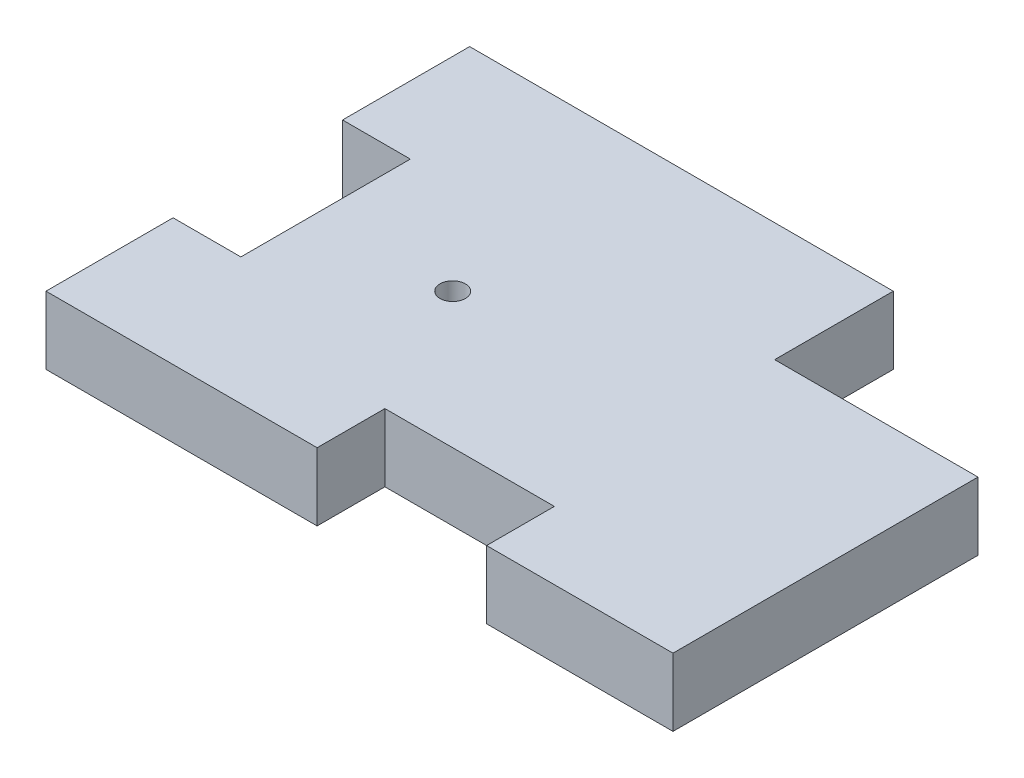
ISO-10303-21;
HEADER;
FILE_DESCRIPTION(('STEP AP214'),'2;1');
FILE_NAME('part.step','',(''),(''),'','','');
FILE_SCHEMA(('AUTOMOTIVE_DESIGN { 1 0 10303 214 1 1 1 1 }'));
ENDSEC;
DATA;
#1=APPLICATION_CONTEXT('core data for automotive mechanical design processes');
#2=APPLICATION_PROTOCOL_DEFINITION('international standard','automotive_design',2000,#1);
#3=PRODUCT_CONTEXT('',#1,'mechanical');
#4=PRODUCT('Part','Part','',(#3));
#5=PRODUCT_RELATED_PRODUCT_CATEGORY('part','',(#4));
#6=PRODUCT_DEFINITION_FORMATION('','',#4);
#7=PRODUCT_DEFINITION_CONTEXT('part definition',#1,'design');
#8=PRODUCT_DEFINITION('design','',#6,#7);
#9=PRODUCT_DEFINITION_SHAPE('','',#8);
#10=(LENGTH_UNIT() NAMED_UNIT(*) SI_UNIT(.MILLI.,.METRE.));
#11=(NAMED_UNIT(*) PLANE_ANGLE_UNIT() SI_UNIT($,.RADIAN.));
#12=(NAMED_UNIT(*) SI_UNIT($,.STERADIAN.) SOLID_ANGLE_UNIT());
#13=UNCERTAINTY_MEASURE_WITH_UNIT(LENGTH_MEASURE(1.E-05),#10,'distance_accuracy_value','');
#14=(GEOMETRIC_REPRESENTATION_CONTEXT(3) GLOBAL_UNCERTAINTY_ASSIGNED_CONTEXT((#13)) GLOBAL_UNIT_ASSIGNED_CONTEXT((#10,
#11,#12)) REPRESENTATION_CONTEXT('',''));
#15=CARTESIAN_POINT('',(0.,0.,0.));
#16=DIRECTION('',(0.,0.,1.));
#17=DIRECTION('',(1.,0.,0.));
#18=AXIS2_PLACEMENT_3D('',#15,#16,#17);
#19=CARTESIAN_POINT('',(0.,4.,25.));
#20=DIRECTION('',(0.,0.,-1.));
#21=DIRECTION('',(-1.,0.,0.));
#22=AXIS2_PLACEMENT_3D('',#19,#20,#21);
#23=PLANE('',#22);
#24=DIRECTION('',(1.,0.,0.));
#25=VECTOR('',#24,1.);
#26=CARTESIAN_POINT('',(0.,0.,25.));
#27=LINE('',#26,#25);
#28=CARTESIAN_POINT('',(0.,0.,25.));
#29=VERTEX_POINT('',#28);
#30=CARTESIAN_POINT('',(15.9999999999999,0.,25.));
#31=VERTEX_POINT('',#30);
#32=EDGE_CURVE('E231',#29,#31,#27,.T.);
#33=ORIENTED_EDGE('',*,*,#32,.T.);
#34=DIRECTION('',(0.,-1.,0.));
#35=VECTOR('',#34,1.);
#36=CARTESIAN_POINT('',(15.9999999999999,4.,25.));
#37=LINE('',#36,#35);
#38=CARTESIAN_POINT('',(15.9999999999999,4.,25.));
#39=VERTEX_POINT('',#38);
#40=EDGE_CURVE('E166',#39,#31,#37,.T.);
#41=ORIENTED_EDGE('',*,*,#40,.F.);
#42=DIRECTION('',(1.,0.,0.));
#43=VECTOR('',#42,1.);
#44=CARTESIAN_POINT('',(0.,4.,25.));
#45=LINE('',#44,#43);
#46=CARTESIAN_POINT('',(0.,4.,25.));
#47=VERTEX_POINT('',#46);
#48=EDGE_CURVE('E153',#47,#39,#45,.T.);
#49=ORIENTED_EDGE('',*,*,#48,.F.);
#50=DIRECTION('',(0.,-1.,0.));
#51=VECTOR('',#50,1.);
#52=CARTESIAN_POINT('',(0.,4.,25.));
#53=LINE('',#52,#51);
#54=EDGE_CURVE('E11',#47,#29,#53,.T.);
#55=ORIENTED_EDGE('',*,*,#54,.T.);
#56=EDGE_LOOP('',(#33,#41,#49,#55));
#57=FACE_BOUND('',#56,.T.);
#58=ADVANCED_FACE('F33',(#57),#23,.F.);
#59=CARTESIAN_POINT('',(0.,4.,0.));
#60=DIRECTION('',(1.,0.,0.));
#61=DIRECTION('',(0.,0.,-1.));
#62=AXIS2_PLACEMENT_3D('',#59,#60,#61);
#63=PLANE('',#62);
#64=DIRECTION('',(0.,0.,1.));
#65=VECTOR('',#64,1.);
#66=CARTESIAN_POINT('',(0.,0.,0.));
#67=LINE('',#66,#65);
#68=CARTESIAN_POINT('',(0.,0.,0.));
#69=VERTEX_POINT('',#68);
#70=CARTESIAN_POINT('',(0.,0.,7.5));
#71=VERTEX_POINT('',#70);
#72=EDGE_CURVE('E227',#69,#71,#67,.T.);
#73=ORIENTED_EDGE('',*,*,#72,.T.);
#74=DIRECTION('',(0.,-1.,0.));
#75=VECTOR('',#74,1.);
#76=CARTESIAN_POINT('',(0.,4.,7.5));
#77=LINE('',#76,#75);
#78=CARTESIAN_POINT('',(0.,4.,7.5));
#79=VERTEX_POINT('',#78);
#80=EDGE_CURVE('E191',#79,#71,#77,.T.);
#81=ORIENTED_EDGE('',*,*,#80,.F.);
#82=DIRECTION('',(0.,0.,1.));
#83=VECTOR('',#82,1.);
#84=CARTESIAN_POINT('',(0.,4.,0.));
#85=LINE('',#84,#83);
#86=CARTESIAN_POINT('',(0.,4.,0.));
#87=VERTEX_POINT('',#86);
#88=EDGE_CURVE('E215',#87,#79,#85,.T.);
#89=ORIENTED_EDGE('',*,*,#88,.F.);
#90=DIRECTION('',(0.,-1.,0.));
#91=VECTOR('',#90,1.);
#92=CARTESIAN_POINT('',(0.,4.,0.));
#93=LINE('',#92,#91);
#94=EDGE_CURVE('E226',#87,#69,#93,.T.);
#95=ORIENTED_EDGE('',*,*,#94,.T.);
#96=EDGE_LOOP('',(#73,#81,#89,#95));
#97=FACE_BOUND('',#96,.T.);
#98=ADVANCED_FACE('F283',(#97),#63,.F.);
#99=CARTESIAN_POINT('',(0.,4.,17.5));
#100=VERTEX_POINT('',#99);
#101=EDGE_CURVE('E219',#100,#47,#85,.T.);
#102=ORIENTED_EDGE('',*,*,#101,.F.);
#103=DIRECTION('',(0.,-1.,0.));
#104=VECTOR('',#103,1.);
#105=CARTESIAN_POINT('',(0.,4.,17.5));
#106=LINE('',#105,#104);
#107=CARTESIAN_POINT('',(0.,0.,17.5));
#108=VERTEX_POINT('',#107);
#109=EDGE_CURVE('E193',#100,#108,#106,.T.);
#110=ORIENTED_EDGE('',*,*,#109,.T.);
#111=EDGE_CURVE('E211',#108,#29,#67,.T.);
#112=ORIENTED_EDGE('',*,*,#111,.T.);
#113=ORIENTED_EDGE('',*,*,#54,.F.);
#114=EDGE_LOOP('',(#102,#110,#112,#113));
#115=FACE_BOUND('',#114,.T.);
#116=ADVANCED_FACE('F35',(#115),#63,.F.);
#117=CARTESIAN_POINT('',(25.9999999999999,4.,25.));
#118=VERTEX_POINT('',#117);
#119=CARTESIAN_POINT('',(37.,4.,25.));
#120=VERTEX_POINT('',#119);
#121=EDGE_CURVE('E218',#118,#120,#45,.T.);
#122=ORIENTED_EDGE('',*,*,#121,.F.);
#123=DIRECTION('',(0.,-1.,0.));
#124=VECTOR('',#123,1.);
#125=CARTESIAN_POINT('',(25.9999999999999,4.,25.));
#126=LINE('',#125,#124);
#127=CARTESIAN_POINT('',(25.9999999999999,0.,25.));
#128=VERTEX_POINT('',#127);
#129=EDGE_CURVE('E168',#118,#128,#126,.T.);
#130=ORIENTED_EDGE('',*,*,#129,.T.);
#131=CARTESIAN_POINT('',(37.,0.,25.));
#132=VERTEX_POINT('',#131);
#133=EDGE_CURVE('E230',#128,#132,#27,.T.);
#134=ORIENTED_EDGE('',*,*,#133,.T.);
#135=DIRECTION('',(0.,-1.,0.));
#136=VECTOR('',#135,1.);
#137=CARTESIAN_POINT('',(37.,4.,25.));
#138=LINE('',#137,#136);
#139=EDGE_CURVE('E41',#120,#132,#138,.T.);
#140=ORIENTED_EDGE('',*,*,#139,.F.);
#141=EDGE_LOOP('',(#122,#130,#134,#140));
#142=FACE_BOUND('',#141,.T.);
#143=ADVANCED_FACE('F262',(#142),#23,.F.);
#144=CARTESIAN_POINT('',(37.,4.,0.));
#145=DIRECTION('',(-1.,0.,0.));
#146=DIRECTION('',(0.,0.,1.));
#147=AXIS2_PLACEMENT_3D('',#144,#145,#146);
#148=PLANE('',#147);
#149=DIRECTION('',(0.,0.,-1.));
#150=VECTOR('',#149,1.);
#151=CARTESIAN_POINT('',(37.,0.,0.));
#152=LINE('',#151,#150);
#153=CARTESIAN_POINT('',(37.,0.,7.));
#154=VERTEX_POINT('',#153);
#155=EDGE_CURVE('E234',#132,#154,#152,.T.);
#156=ORIENTED_EDGE('',*,*,#155,.T.);
#157=DIRECTION('',(0.,1.,0.));
#158=VECTOR('',#157,1.);
#159=CARTESIAN_POINT('',(37.,0.,7.));
#160=LINE('',#159,#158);
#161=CARTESIAN_POINT('',(37.,4.,7.));
#162=VERTEX_POINT('',#161);
#163=EDGE_CURVE('E208',#154,#162,#160,.T.);
#164=ORIENTED_EDGE('',*,*,#163,.T.);
#165=DIRECTION('',(0.,0.,-1.));
#166=VECTOR('',#165,1.);
#167=CARTESIAN_POINT('',(37.,4.,0.));
#168=LINE('',#167,#166);
#169=EDGE_CURVE('E221',#120,#162,#168,.T.);
#170=ORIENTED_EDGE('',*,*,#169,.F.);
#171=ORIENTED_EDGE('',*,*,#139,.T.);
#172=EDGE_LOOP('',(#156,#164,#170,#171));
#173=FACE_BOUND('',#172,.T.);
#174=ADVANCED_FACE('F245',(#173),#148,.F.);
#175=CARTESIAN_POINT('',(0.,4.,0.));
#176=DIRECTION('',(0.,0.,1.));
#177=DIRECTION('',(1.,0.,0.));
#178=AXIS2_PLACEMENT_3D('',#175,#176,#177);
#179=PLANE('',#178);
#180=DIRECTION('',(-1.,0.,0.));
#181=VECTOR('',#180,1.);
#182=CARTESIAN_POINT('',(0.,4.,0.));
#183=LINE('',#182,#181);
#184=CARTESIAN_POINT('',(25.,4.,0.));
#185=VERTEX_POINT('',#184);
#186=EDGE_CURVE('E224',#185,#87,#183,.T.);
#187=ORIENTED_EDGE('',*,*,#186,.F.);
#188=DIRECTION('',(0.,1.,0.));
#189=VECTOR('',#188,1.);
#190=CARTESIAN_POINT('',(25.,0.,0.));
#191=LINE('',#190,#189);
#192=CARTESIAN_POINT('',(25.,0.,0.));
#193=VERTEX_POINT('',#192);
#194=EDGE_CURVE('E204',#193,#185,#191,.T.);
#195=ORIENTED_EDGE('',*,*,#194,.F.);
#196=DIRECTION('',(-1.,0.,0.));
#197=VECTOR('',#196,1.);
#198=CARTESIAN_POINT('',(0.,0.,0.));
#199=LINE('',#198,#197);
#200=EDGE_CURVE('E237',#193,#69,#199,.T.);
#201=ORIENTED_EDGE('',*,*,#200,.T.);
#202=ORIENTED_EDGE('',*,*,#94,.F.);
#203=EDGE_LOOP('',(#187,#195,#201,#202));
#204=FACE_BOUND('',#203,.T.);
#205=ADVANCED_FACE('F287',(#204),#179,.F.);
#206=CARTESIAN_POINT('',(0.,4.,0.));
#207=DIRECTION('',(0.,1.,0.));
#208=DIRECTION('',(0.,0.,1.));
#209=AXIS2_PLACEMENT_3D('',#206,#207,#208);
#210=PLANE('',#209);
#211=CARTESIAN_POINT('',(12.,4.,13.));
#212=DIRECTION('',(0.,1.,0.));
#213=DIRECTION('',(0.,0.,1.));
#214=AXIS2_PLACEMENT_3D('',#211,#212,#213);
#215=CIRCLE('',#214,0.75);
#216=CARTESIAN_POINT('',(12.,4.,13.75));
#217=VERTEX_POINT('',#216);
#218=EDGE_CURVE('E159',#217,#217,#215,.T.);
#219=ORIENTED_EDGE('',*,*,#218,.F.);
#220=EDGE_LOOP('',(#219));
#221=FACE_BOUND('',#220,.T.);
#222=DIRECTION('',(0.,0.,-1.));
#223=VECTOR('',#222,1.);
#224=CARTESIAN_POINT('',(15.9999999999999,4.,21.));
#225=LINE('',#224,#223);
#226=CARTESIAN_POINT('',(15.9999999999999,4.,21.));
#227=VERTEX_POINT('',#226);
#228=EDGE_CURVE('E135',#39,#227,#225,.T.);
#229=ORIENTED_EDGE('',*,*,#228,.T.);
#230=DIRECTION('',(1.,0.,0.));
#231=VECTOR('',#230,1.);
#232=CARTESIAN_POINT('',(15.9999999999999,4.,21.));
#233=LINE('',#232,#231);
#234=CARTESIAN_POINT('',(25.9999999999999,4.,21.));
#235=VERTEX_POINT('',#234);
#236=EDGE_CURVE('E144',#227,#235,#233,.T.);
#237=ORIENTED_EDGE('',*,*,#236,.T.);
#238=DIRECTION('',(0.,0.,1.));
#239=VECTOR('',#238,1.);
#240=CARTESIAN_POINT('',(25.9999999999999,4.,21.));
#241=LINE('',#240,#239);
#242=EDGE_CURVE('E141',#235,#118,#241,.T.);
#243=ORIENTED_EDGE('',*,*,#242,.T.);
#244=ORIENTED_EDGE('',*,*,#121,.T.);
#245=ORIENTED_EDGE('',*,*,#169,.T.);
#246=DIRECTION('',(1.,0.,0.));
#247=VECTOR('',#246,1.);
#248=CARTESIAN_POINT('',(37.,4.,7.));
#249=LINE('',#248,#247);
#250=CARTESIAN_POINT('',(25.,4.,7.));
#251=VERTEX_POINT('',#250);
#252=EDGE_CURVE('E201',#251,#162,#249,.T.);
#253=ORIENTED_EDGE('',*,*,#252,.F.);
#254=DIRECTION('',(0.,0.,1.));
#255=VECTOR('',#254,1.);
#256=CARTESIAN_POINT('',(25.,4.,0.));
#257=LINE('',#256,#255);
#258=EDGE_CURVE('E190',#185,#251,#257,.T.);
#259=ORIENTED_EDGE('',*,*,#258,.F.);
#260=ORIENTED_EDGE('',*,*,#186,.T.);
#261=ORIENTED_EDGE('',*,*,#88,.T.);
#262=DIRECTION('',(1.,0.,0.));
#263=VECTOR('',#262,1.);
#264=CARTESIAN_POINT('',(4.,4.,7.5));
#265=LINE('',#264,#263);
#266=CARTESIAN_POINT('',(4.,4.,7.5));
#267=VERTEX_POINT('',#266);
#268=EDGE_CURVE('E179',#79,#267,#265,.T.);
#269=ORIENTED_EDGE('',*,*,#268,.T.);
#270=DIRECTION('',(0.,0.,1.));
#271=VECTOR('',#270,1.);
#272=CARTESIAN_POINT('',(4.,4.,7.5));
#273=LINE('',#272,#271);
#274=CARTESIAN_POINT('',(4.,4.,17.5));
#275=VERTEX_POINT('',#274);
#276=EDGE_CURVE('E172',#267,#275,#273,.T.);
#277=ORIENTED_EDGE('',*,*,#276,.T.);
#278=DIRECTION('',(-1.,0.,0.));
#279=VECTOR('',#278,1.);
#280=CARTESIAN_POINT('',(4.,4.,17.5));
#281=LINE('',#280,#279);
#282=EDGE_CURVE('E175',#275,#100,#281,.T.);
#283=ORIENTED_EDGE('',*,*,#282,.T.);
#284=ORIENTED_EDGE('',*,*,#101,.T.);
#285=ORIENTED_EDGE('',*,*,#48,.T.);
#286=EDGE_LOOP('',(#229,#237,#243,#244,#245,#253,#259,#260,#261,#269,#277,#283,#284,#285));
#287=FACE_BOUND('',#286,.T.);
#288=ADVANCED_FACE('F151',(#221,#287),#210,.T.);
#289=CARTESIAN_POINT('',(0.,0.,0.));
#290=DIRECTION('',(0.,1.,0.));
#291=DIRECTION('',(0.,0.,1.));
#292=AXIS2_PLACEMENT_3D('',#289,#290,#291);
#293=PLANE('',#292);
#294=CARTESIAN_POINT('',(12.,0.,13.));
#295=DIRECTION('',(0.,1.,0.));
#296=DIRECTION('',(0.,0.,1.));
#297=AXIS2_PLACEMENT_3D('',#294,#295,#296);
#298=CIRCLE('',#297,0.75);
#299=CARTESIAN_POINT('',(12.,0.,13.75));
#300=VERTEX_POINT('',#299);
#301=EDGE_CURVE('E164',#300,#300,#298,.T.);
#302=ORIENTED_EDGE('',*,*,#301,.T.);
#303=EDGE_LOOP('',(#302));
#304=FACE_BOUND('',#303,.T.);
#305=DIRECTION('',(1.,0.,0.));
#306=VECTOR('',#305,1.);
#307=CARTESIAN_POINT('',(15.9999999999999,0.,21.));
#308=LINE('',#307,#306);
#309=CARTESIAN_POINT('',(15.9999999999999,0.,21.));
#310=VERTEX_POINT('',#309);
#311=CARTESIAN_POINT('',(25.9999999999999,0.,21.));
#312=VERTEX_POINT('',#311);
#313=EDGE_CURVE('E156',#310,#312,#308,.T.);
#314=ORIENTED_EDGE('',*,*,#313,.F.);
#315=DIRECTION('',(0.,0.,-1.));
#316=VECTOR('',#315,1.);
#317=CARTESIAN_POINT('',(15.9999999999999,0.,21.));
#318=LINE('',#317,#316);
#319=EDGE_CURVE('E48',#31,#310,#318,.T.);
#320=ORIENTED_EDGE('',*,*,#319,.F.);
#321=ORIENTED_EDGE('',*,*,#32,.F.);
#322=ORIENTED_EDGE('',*,*,#111,.F.);
#323=DIRECTION('',(-1.,0.,0.));
#324=VECTOR('',#323,1.);
#325=CARTESIAN_POINT('',(4.,0.,17.5));
#326=LINE('',#325,#324);
#327=CARTESIAN_POINT('',(4.,0.,17.5));
#328=VERTEX_POINT('',#327);
#329=EDGE_CURVE('E184',#328,#108,#326,.T.);
#330=ORIENTED_EDGE('',*,*,#329,.F.);
#331=DIRECTION('',(0.,0.,1.));
#332=VECTOR('',#331,1.);
#333=CARTESIAN_POINT('',(4.,0.,7.5));
#334=LINE('',#333,#332);
#335=CARTESIAN_POINT('',(4.,0.,7.5));
#336=VERTEX_POINT('',#335);
#337=EDGE_CURVE('E56',#336,#328,#334,.T.);
#338=ORIENTED_EDGE('',*,*,#337,.F.);
#339=DIRECTION('',(1.,0.,0.));
#340=VECTOR('',#339,1.);
#341=CARTESIAN_POINT('',(4.,0.,7.5));
#342=LINE('',#341,#340);
#343=EDGE_CURVE('E176',#71,#336,#342,.T.);
#344=ORIENTED_EDGE('',*,*,#343,.F.);
#345=ORIENTED_EDGE('',*,*,#72,.F.);
#346=ORIENTED_EDGE('',*,*,#200,.F.);
#347=DIRECTION('',(0.,0.,1.));
#348=VECTOR('',#347,1.);
#349=CARTESIAN_POINT('',(25.,0.,0.));
#350=LINE('',#349,#348);
#351=CARTESIAN_POINT('',(25.,0.,7.));
#352=VERTEX_POINT('',#351);
#353=EDGE_CURVE('E197',#193,#352,#350,.T.);
#354=ORIENTED_EDGE('',*,*,#353,.T.);
#355=DIRECTION('',(1.,0.,0.));
#356=VECTOR('',#355,1.);
#357=CARTESIAN_POINT('',(37.,0.,7.));
#358=LINE('',#357,#356);
#359=EDGE_CURVE('E200',#352,#154,#358,.T.);
#360=ORIENTED_EDGE('',*,*,#359,.T.);
#361=ORIENTED_EDGE('',*,*,#155,.F.);
#362=ORIENTED_EDGE('',*,*,#133,.F.);
#363=DIRECTION('',(0.,0.,1.));
#364=VECTOR('',#363,1.);
#365=CARTESIAN_POINT('',(25.9999999999999,0.,21.));
#366=LINE('',#365,#364);
#367=EDGE_CURVE('E154',#312,#128,#366,.T.);
#368=ORIENTED_EDGE('',*,*,#367,.F.);
#369=EDGE_LOOP('',(#314,#320,#321,#322,#330,#338,#344,#345,#346,#354,#360,#361,#362,#368));
#370=FACE_BOUND('',#369,.T.);
#371=ADVANCED_FACE('F250',(#304,#370),#293,.F.);
#372=CARTESIAN_POINT('',(37.,0.,7.));
#373=DIRECTION('',(0.,0.,1.));
#374=DIRECTION('',(1.,0.,0.));
#375=AXIS2_PLACEMENT_3D('',#372,#373,#374);
#376=PLANE('',#375);
#377=ORIENTED_EDGE('',*,*,#252,.T.);
#378=ORIENTED_EDGE('',*,*,#163,.F.);
#379=ORIENTED_EDGE('',*,*,#359,.F.);
#380=DIRECTION('',(0.,1.,0.));
#381=VECTOR('',#380,1.);
#382=CARTESIAN_POINT('',(25.,0.,7.));
#383=LINE('',#382,#381);
#384=EDGE_CURVE('E212',#352,#251,#383,.T.);
#385=ORIENTED_EDGE('',*,*,#384,.T.);
#386=EDGE_LOOP('',(#377,#378,#379,#385));
#387=FACE_BOUND('',#386,.T.);
#388=ADVANCED_FACE('F255',(#387),#376,.F.);
#389=CARTESIAN_POINT('',(25.,0.,0.));
#390=DIRECTION('',(-1.,0.,0.));
#391=DIRECTION('',(0.,0.,1.));
#392=AXIS2_PLACEMENT_3D('',#389,#390,#391);
#393=PLANE('',#392);
#394=ORIENTED_EDGE('',*,*,#258,.T.);
#395=ORIENTED_EDGE('',*,*,#384,.F.);
#396=ORIENTED_EDGE('',*,*,#353,.F.);
#397=ORIENTED_EDGE('',*,*,#194,.T.);
#398=EDGE_LOOP('',(#394,#395,#396,#397));
#399=FACE_BOUND('',#398,.T.);
#400=ADVANCED_FACE('F257',(#399),#393,.F.);
#401=CARTESIAN_POINT('',(4.,4.,7.5));
#402=DIRECTION('',(1.,0.,0.));
#403=DIRECTION('',(0.,0.,-1.));
#404=AXIS2_PLACEMENT_3D('',#401,#402,#403);
#405=PLANE('',#404);
#406=ORIENTED_EDGE('',*,*,#337,.T.);
#407=DIRECTION('',(0.,-1.,0.));
#408=VECTOR('',#407,1.);
#409=CARTESIAN_POINT('',(4.,4.,17.5));
#410=LINE('',#409,#408);
#411=EDGE_CURVE('E182',#275,#328,#410,.T.);
#412=ORIENTED_EDGE('',*,*,#411,.F.);
#413=ORIENTED_EDGE('',*,*,#276,.F.);
#414=DIRECTION('',(0.,-1.,0.));
#415=VECTOR('',#414,1.);
#416=CARTESIAN_POINT('',(4.,4.,7.5));
#417=LINE('',#416,#415);
#418=EDGE_CURVE('E188',#267,#336,#417,.T.);
#419=ORIENTED_EDGE('',*,*,#418,.T.);
#420=EDGE_LOOP('',(#406,#412,#413,#419));
#421=FACE_BOUND('',#420,.T.);
#422=ADVANCED_FACE('F277',(#421),#405,.F.);
#423=CARTESIAN_POINT('',(4.,4.,7.5));
#424=DIRECTION('',(0.,0.,-1.));
#425=DIRECTION('',(-1.,0.,0.));
#426=AXIS2_PLACEMENT_3D('',#423,#424,#425);
#427=PLANE('',#426);
#428=ORIENTED_EDGE('',*,*,#343,.T.);
#429=ORIENTED_EDGE('',*,*,#418,.F.);
#430=ORIENTED_EDGE('',*,*,#268,.F.);
#431=ORIENTED_EDGE('',*,*,#80,.T.);
#432=EDGE_LOOP('',(#428,#429,#430,#431));
#433=FACE_BOUND('',#432,.T.);
#434=ADVANCED_FACE('F281',(#433),#427,.F.);
#435=CARTESIAN_POINT('',(4.,4.,17.5));
#436=DIRECTION('',(0.,0.,1.));
#437=DIRECTION('',(1.,0.,0.));
#438=AXIS2_PLACEMENT_3D('',#435,#436,#437);
#439=PLANE('',#438);
#440=ORIENTED_EDGE('',*,*,#329,.T.);
#441=ORIENTED_EDGE('',*,*,#109,.F.);
#442=ORIENTED_EDGE('',*,*,#282,.F.);
#443=ORIENTED_EDGE('',*,*,#411,.T.);
#444=EDGE_LOOP('',(#440,#441,#442,#443));
#445=FACE_BOUND('',#444,.T.);
#446=ADVANCED_FACE('F274',(#445),#439,.F.);
#447=CARTESIAN_POINT('',(15.9999999999999,4.,21.));
#448=DIRECTION('',(-1.,0.,0.));
#449=DIRECTION('',(0.,0.,1.));
#450=AXIS2_PLACEMENT_3D('',#447,#448,#449);
#451=PLANE('',#450);
#452=ORIENTED_EDGE('',*,*,#319,.T.);
#453=DIRECTION('',(0.,-1.,0.));
#454=VECTOR('',#453,1.);
#455=CARTESIAN_POINT('',(15.9999999999999,4.,21.));
#456=LINE('',#455,#454);
#457=EDGE_CURVE('E131',#227,#310,#456,.T.);
#458=ORIENTED_EDGE('',*,*,#457,.F.);
#459=ORIENTED_EDGE('',*,*,#228,.F.);
#460=ORIENTED_EDGE('',*,*,#40,.T.);
#461=EDGE_LOOP('',(#452,#458,#459,#460));
#462=FACE_BOUND('',#461,.T.);
#463=ADVANCED_FACE('F133',(#462),#451,.F.);
#464=CARTESIAN_POINT('',(25.9999999999999,4.,21.));
#465=DIRECTION('',(1.,0.,0.));
#466=DIRECTION('',(0.,0.,-1.));
#467=AXIS2_PLACEMENT_3D('',#464,#465,#466);
#468=PLANE('',#467);
#469=ORIENTED_EDGE('',*,*,#367,.T.);
#470=ORIENTED_EDGE('',*,*,#129,.F.);
#471=ORIENTED_EDGE('',*,*,#242,.F.);
#472=DIRECTION('',(0.,-1.,0.));
#473=VECTOR('',#472,1.);
#474=CARTESIAN_POINT('',(25.9999999999999,4.,21.));
#475=LINE('',#474,#473);
#476=EDGE_CURVE('E140',#235,#312,#475,.T.);
#477=ORIENTED_EDGE('',*,*,#476,.T.);
#478=EDGE_LOOP('',(#469,#470,#471,#477));
#479=FACE_BOUND('',#478,.T.);
#480=ADVANCED_FACE('F264',(#479),#468,.F.);
#481=CARTESIAN_POINT('',(15.9999999999999,4.,21.));
#482=DIRECTION('',(0.,0.,-1.));
#483=DIRECTION('',(-1.,0.,0.));
#484=AXIS2_PLACEMENT_3D('',#481,#482,#483);
#485=PLANE('',#484);
#486=ORIENTED_EDGE('',*,*,#313,.T.);
#487=ORIENTED_EDGE('',*,*,#476,.F.);
#488=ORIENTED_EDGE('',*,*,#236,.F.);
#489=ORIENTED_EDGE('',*,*,#457,.T.);
#490=EDGE_LOOP('',(#486,#487,#488,#489));
#491=FACE_BOUND('',#490,.T.);
#492=ADVANCED_FACE('F145',(#491),#485,.F.);
#493=CARTESIAN_POINT('',(12.,0.,13.));
#494=DIRECTION('',(0.,1.,0.));
#495=DIRECTION('',(0.,0.,1.));
#496=AXIS2_PLACEMENT_3D('',#493,#494,#495);
#497=CYLINDRICAL_SURFACE('',#496,0.75);
#498=ORIENTED_EDGE('',*,*,#301,.F.);
#499=EDGE_LOOP('',(#498));
#500=FACE_BOUND('',#499,.T.);
#501=ORIENTED_EDGE('',*,*,#218,.T.);
#502=EDGE_LOOP('',(#501));
#503=FACE_BOUND('',#502,.T.);
#504=ADVANCED_FACE('F379',(#500,#503),#497,.F.);
#505=CLOSED_SHELL('',(#58,#98,#116,#143,#174,#205,#288,#371,#388,#400,#422,#434,#446,#463,#480,
#492,#504));
#506=MANIFOLD_SOLID_BREP('B2',#505);
#507=ADVANCED_BREP_SHAPE_REPRESENTATION('',(#18,#506),#14);
#508=SHAPE_DEFINITION_REPRESENTATION(#9,#507);
ENDSEC;
END-ISO-10303-21;
